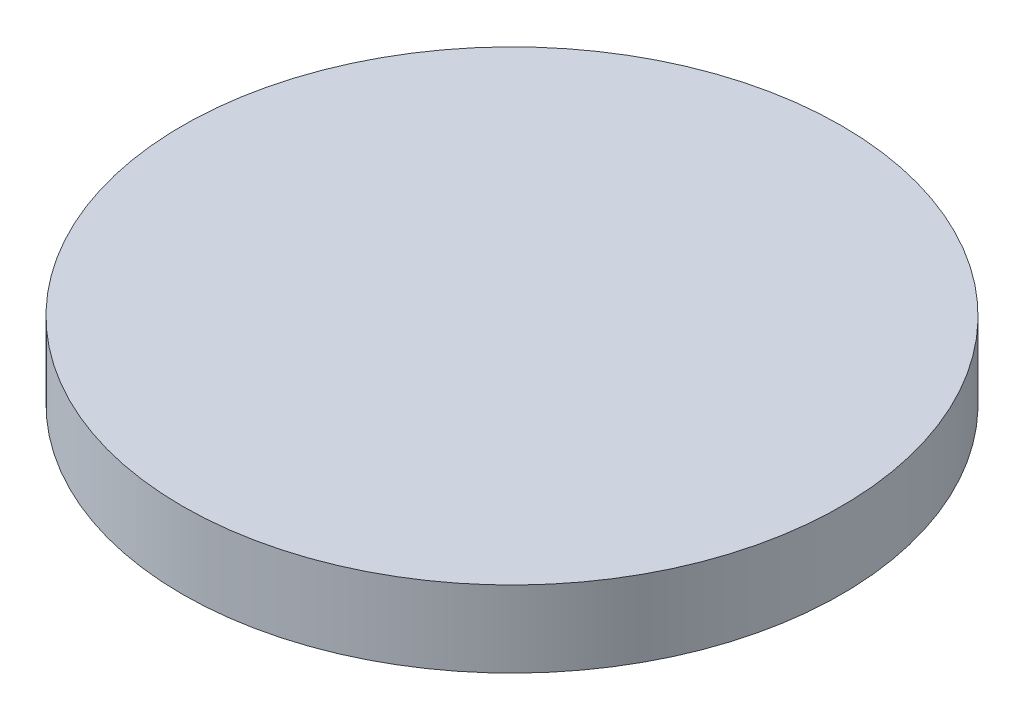
ISO-10303-21;
HEADER;
FILE_DESCRIPTION(('STEP AP214'),'2;1');
FILE_NAME('part.step','',(''),(''),'','','');
FILE_SCHEMA(('AUTOMOTIVE_DESIGN { 1 0 10303 214 1 1 1 1 }'));
ENDSEC;
DATA;
#1=APPLICATION_CONTEXT('core data for automotive mechanical design processes');
#2=APPLICATION_PROTOCOL_DEFINITION('international standard','automotive_design',2000,#1);
#3=PRODUCT_CONTEXT('',#1,'mechanical');
#4=PRODUCT('Part','Part','',(#3));
#5=PRODUCT_RELATED_PRODUCT_CATEGORY('part','',(#4));
#6=PRODUCT_DEFINITION_FORMATION('','',#4);
#7=PRODUCT_DEFINITION_CONTEXT('part definition',#1,'design');
#8=PRODUCT_DEFINITION('design','',#6,#7);
#9=PRODUCT_DEFINITION_SHAPE('','',#8);
#10=(LENGTH_UNIT() NAMED_UNIT(*) SI_UNIT(.MILLI.,.METRE.));
#11=(NAMED_UNIT(*) PLANE_ANGLE_UNIT() SI_UNIT($,.RADIAN.));
#12=(NAMED_UNIT(*) SI_UNIT($,.STERADIAN.) SOLID_ANGLE_UNIT());
#13=UNCERTAINTY_MEASURE_WITH_UNIT(LENGTH_MEASURE(1.E-05),#10,'distance_accuracy_value','');
#14=(GEOMETRIC_REPRESENTATION_CONTEXT(3) GLOBAL_UNCERTAINTY_ASSIGNED_CONTEXT((#13)) GLOBAL_UNIT_ASSIGNED_CONTEXT((#10,
#11,#12)) REPRESENTATION_CONTEXT('',''));
#15=CARTESIAN_POINT('',(0.,0.,0.));
#16=DIRECTION('',(0.,0.,1.));
#17=DIRECTION('',(1.,0.,0.));
#18=AXIS2_PLACEMENT_3D('',#15,#16,#17);
#19=CARTESIAN_POINT('',(0.,2.2,0.));
#20=DIRECTION('',(0.,-1.,0.));
#21=DIRECTION('',(0.,0.,-1.));
#22=AXIS2_PLACEMENT_3D('',#19,#20,#21);
#23=CYLINDRICAL_SURFACE('',#22,9.5);
#24=CARTESIAN_POINT('',(0.,2.2,0.));
#25=DIRECTION('',(0.,1.,0.));
#26=DIRECTION('',(0.,0.,1.));
#27=AXIS2_PLACEMENT_3D('',#24,#25,#26);
#28=CIRCLE('',#27,9.5);
#29=CARTESIAN_POINT('',(0.,2.2,9.5));
#30=VERTEX_POINT('',#29);
#31=EDGE_CURVE('E10',#30,#30,#28,.T.);
#32=ORIENTED_EDGE('',*,*,#31,.F.);
#33=EDGE_LOOP('',(#32));
#34=FACE_BOUND('',#33,.T.);
#35=CARTESIAN_POINT('',(0.,0.,0.));
#36=DIRECTION('',(0.,1.,0.));
#37=DIRECTION('',(0.,0.,1.));
#38=AXIS2_PLACEMENT_3D('',#35,#36,#37);
#39=CIRCLE('',#38,9.5);
#40=CARTESIAN_POINT('',(0.,0.,9.5));
#41=VERTEX_POINT('',#40);
#42=EDGE_CURVE('E39',#41,#41,#39,.T.);
#43=ORIENTED_EDGE('',*,*,#42,.T.);
#44=EDGE_LOOP('',(#43));
#45=FACE_BOUND('',#44,.T.);
#46=ADVANCED_FACE('F36',(#34,#45),#23,.T.);
#47=CARTESIAN_POINT('',(0.,2.2,0.));
#48=DIRECTION('',(0.,1.,0.));
#49=DIRECTION('',(0.,0.,1.));
#50=AXIS2_PLACEMENT_3D('',#47,#48,#49);
#51=PLANE('',#50);
#52=ORIENTED_EDGE('',*,*,#31,.T.);
#53=EDGE_LOOP('',(#52));
#54=FACE_BOUND('',#53,.T.);
#55=ADVANCED_FACE('F51',(#54),#51,.T.);
#56=CARTESIAN_POINT('',(0.,0.,0.));
#57=DIRECTION('',(0.,1.,0.));
#58=DIRECTION('',(0.,0.,1.));
#59=AXIS2_PLACEMENT_3D('',#56,#57,#58);
#60=PLANE('',#59);
#61=ORIENTED_EDGE('',*,*,#42,.F.);
#62=EDGE_LOOP('',(#61));
#63=FACE_BOUND('',#62,.T.);
#64=ADVANCED_FACE('F49',(#63),#60,.F.);
#65=CLOSED_SHELL('',(#46,#55,#64));
#66=MANIFOLD_SOLID_BREP('B2',#65);
#67=ADVANCED_BREP_SHAPE_REPRESENTATION('',(#18,#66),#14);
#68=SHAPE_DEFINITION_REPRESENTATION(#9,#67);
ENDSEC;
END-ISO-10303-21;
